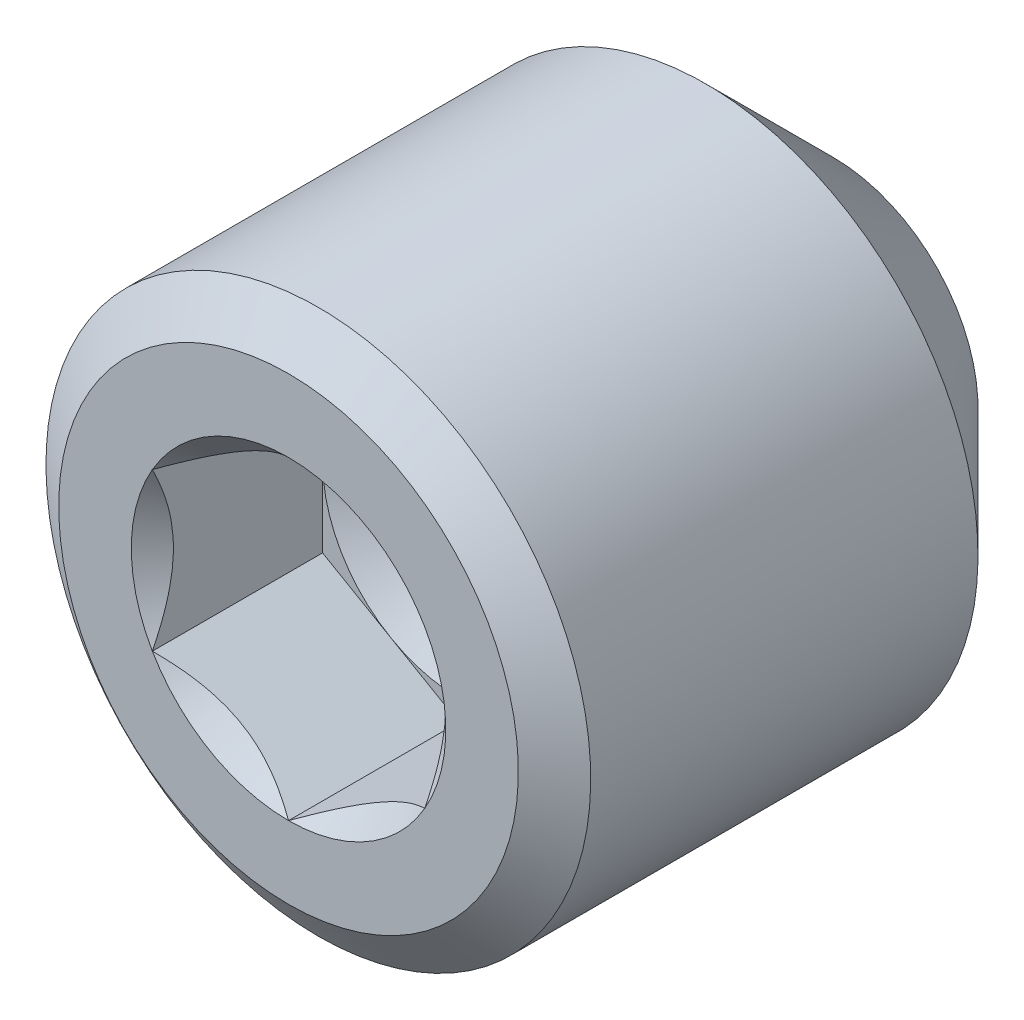
ISO-10303-21;
HEADER;
FILE_DESCRIPTION(('STEP AP214'),'2;1');
FILE_NAME('part.step','',(''),(''),'','','');
FILE_SCHEMA(('AUTOMOTIVE_DESIGN { 1 0 10303 214 1 1 1 1 }'));
ENDSEC;
DATA;
#1=APPLICATION_CONTEXT('core data for automotive mechanical design processes');
#2=APPLICATION_PROTOCOL_DEFINITION('international standard','automotive_design',2000,#1);
#3=PRODUCT_CONTEXT('',#1,'mechanical');
#4=PRODUCT('Part','Part','',(#3));
#5=PRODUCT_RELATED_PRODUCT_CATEGORY('part','',(#4));
#6=PRODUCT_DEFINITION_FORMATION('','',#4);
#7=PRODUCT_DEFINITION_CONTEXT('part definition',#1,'design');
#8=PRODUCT_DEFINITION('design','',#6,#7);
#9=PRODUCT_DEFINITION_SHAPE('','',#8);
#10=(LENGTH_UNIT() NAMED_UNIT(*) SI_UNIT(.MILLI.,.METRE.));
#11=(NAMED_UNIT(*) PLANE_ANGLE_UNIT() SI_UNIT($,.RADIAN.));
#12=(NAMED_UNIT(*) SI_UNIT($,.STERADIAN.) SOLID_ANGLE_UNIT());
#13=UNCERTAINTY_MEASURE_WITH_UNIT(LENGTH_MEASURE(1.E-05),#10,'distance_accuracy_value','');
#14=(GEOMETRIC_REPRESENTATION_CONTEXT(3) GLOBAL_UNCERTAINTY_ASSIGNED_CONTEXT((#13)) GLOBAL_UNIT_ASSIGNED_CONTEXT((#10,
#11,#12)) REPRESENTATION_CONTEXT('',''));
#15=CARTESIAN_POINT('',(0.,0.,0.));
#16=DIRECTION('',(0.,0.,1.));
#17=DIRECTION('',(1.,0.,0.));
#18=AXIS2_PLACEMENT_3D('',#15,#16,#17);
#19=CARTESIAN_POINT('',(-2.,3.46410161513775,1.5));
#20=DIRECTION('',(0.,0.,1.));
#21=DIRECTION('',(1.,0.,0.));
#22=AXIS2_PLACEMENT_3D('',#19,#20,#21);
#23=PLANE('',#22);
#24=CARTESIAN_POINT('',(0.,0.,1.5));
#25=DIRECTION('',(0.,0.,1.));
#26=DIRECTION('',(1.,0.,0.));
#27=AXIS2_PLACEMENT_3D('',#24,#25,#26);
#28=CIRCLE('',#27,2.);
#29=CARTESIAN_POINT('',(2.,0.,1.5));
#30=VERTEX_POINT('',#29);
#31=CARTESIAN_POINT('',(0.999999999999994,1.73205080756888,1.5));
#32=VERTEX_POINT('',#31);
#33=EDGE_CURVE('E126',#30,#32,#28,.T.);
#34=ORIENTED_EDGE('',*,*,#33,.F.);
#35=DIRECTION('',(0.,1.,0.));
#36=VECTOR('',#35,1.);
#37=CARTESIAN_POINT('',(2.,-1.15470053837925,1.5));
#38=LINE('',#37,#36);
#39=CARTESIAN_POINT('',(2.,1.15470053837925,1.5));
#40=VERTEX_POINT('',#39);
#41=EDGE_CURVE('E152',#30,#40,#38,.T.);
#42=ORIENTED_EDGE('',*,*,#41,.T.);
#43=DIRECTION('',(-0.866025403784439,0.5,0.));
#44=VECTOR('',#43,1.);
#45=CARTESIAN_POINT('',(2.,1.15470053837925,1.5));
#46=LINE('',#45,#44);
#47=EDGE_CURVE('E147',#40,#32,#46,.T.);
#48=ORIENTED_EDGE('',*,*,#47,.T.);
#49=EDGE_LOOP('',(#34,#42,#48));
#50=FACE_BOUND('',#49,.T.);
#51=ADVANCED_FACE('F39',(#50),#23,.T.);
#52=CARTESIAN_POINT('',(-0.999999999999995,1.73205080756888,1.5));
#53=VERTEX_POINT('',#52);
#54=EDGE_CURVE('E128',#32,#53,#28,.T.);
#55=ORIENTED_EDGE('',*,*,#54,.F.);
#56=CARTESIAN_POINT('',(0.,2.3094010767585,1.5));
#57=VERTEX_POINT('',#56);
#58=EDGE_CURVE('E139',#32,#57,#46,.T.);
#59=ORIENTED_EDGE('',*,*,#58,.T.);
#60=DIRECTION('',(-0.866025403784438,-0.5,0.));
#61=VECTOR('',#60,1.);
#62=CARTESIAN_POINT('',(0.,2.3094010767585,1.5));
#63=LINE('',#62,#61);
#64=EDGE_CURVE('E142',#57,#53,#63,.T.);
#65=ORIENTED_EDGE('',*,*,#64,.T.);
#66=EDGE_LOOP('',(#55,#59,#65));
#67=FACE_BOUND('',#66,.T.);
#68=ADVANCED_FACE('F138',(#67),#23,.T.);
#69=CARTESIAN_POINT('',(-2.,0.,1.5));
#70=VERTEX_POINT('',#69);
#71=EDGE_CURVE('E143',#53,#70,#28,.T.);
#72=ORIENTED_EDGE('',*,*,#71,.F.);
#73=CARTESIAN_POINT('',(-2.,1.15470053837925,1.5));
#74=VERTEX_POINT('',#73);
#75=EDGE_CURVE('E154',#53,#74,#63,.T.);
#76=ORIENTED_EDGE('',*,*,#75,.T.);
#77=DIRECTION('',(0.,-1.,0.));
#78=VECTOR('',#77,1.);
#79=CARTESIAN_POINT('',(-2.,1.15470053837925,1.5));
#80=LINE('',#79,#78);
#81=EDGE_CURVE('E165',#74,#70,#80,.T.);
#82=ORIENTED_EDGE('',*,*,#81,.T.);
#83=EDGE_LOOP('',(#72,#76,#82));
#84=FACE_BOUND('',#83,.T.);
#85=ADVANCED_FACE('F242',(#84),#23,.T.);
#86=CARTESIAN_POINT('',(-1.,-1.73205080756887,1.5));
#87=VERTEX_POINT('',#86);
#88=EDGE_CURVE('E266',#70,#87,#28,.T.);
#89=ORIENTED_EDGE('',*,*,#88,.F.);
#90=CARTESIAN_POINT('',(-2.,-1.15470053837925,1.5));
#91=VERTEX_POINT('',#90);
#92=EDGE_CURVE('E164',#70,#91,#80,.T.);
#93=ORIENTED_EDGE('',*,*,#92,.T.);
#94=DIRECTION('',(0.866025403784439,-0.5,0.));
#95=VECTOR('',#94,1.);
#96=CARTESIAN_POINT('',(-2.,-1.15470053837925,1.5));
#97=LINE('',#96,#95);
#98=EDGE_CURVE('E169',#91,#87,#97,.T.);
#99=ORIENTED_EDGE('',*,*,#98,.T.);
#100=EDGE_LOOP('',(#89,#93,#99));
#101=FACE_BOUND('',#100,.T.);
#102=ADVANCED_FACE('F256',(#101),#23,.T.);
#103=CARTESIAN_POINT('',(1.,-1.73205080756887,1.5));
#104=VERTEX_POINT('',#103);
#105=EDGE_CURVE('E60',#87,#104,#28,.T.);
#106=ORIENTED_EDGE('',*,*,#105,.F.);
#107=CARTESIAN_POINT('',(0.,-2.3094010767585,1.5));
#108=VERTEX_POINT('',#107);
#109=EDGE_CURVE('E168',#87,#108,#97,.T.);
#110=ORIENTED_EDGE('',*,*,#109,.T.);
#111=DIRECTION('',(0.866025403784438,0.5,0.));
#112=VECTOR('',#111,1.);
#113=CARTESIAN_POINT('',(0.,-2.3094010767585,1.5));
#114=LINE('',#113,#112);
#115=EDGE_CURVE('E173',#108,#104,#114,.T.);
#116=ORIENTED_EDGE('',*,*,#115,.T.);
#117=EDGE_LOOP('',(#106,#110,#116));
#118=FACE_BOUND('',#117,.T.);
#119=ADVANCED_FACE('F247',(#118),#23,.T.);
#120=CARTESIAN_POINT('',(0.,0.,4.));
#121=DIRECTION('',(0.,0.,-1.));
#122=DIRECTION('',(0.,1.,0.));
#123=AXIS2_PLACEMENT_3D('',#120,#121,#122);
#124=PLANE('',#123);
#125=CARTESIAN_POINT('',(0.,0.,4.));
#126=DIRECTION('',(0.,0.,1.));
#127=DIRECTION('',(1.,0.,0.));
#128=AXIS2_PLACEMENT_3D('',#125,#126,#127);
#129=CIRCLE('',#128,2.3094010767585);
#130=CARTESIAN_POINT('',(0.,2.3094010767585,4.));
#131=VERTEX_POINT('',#130);
#132=CARTESIAN_POINT('',(-2.,1.15470053837925,4.));
#133=VERTEX_POINT('',#132);
#134=EDGE_CURVE('E290',#131,#133,#129,.T.);
#135=ORIENTED_EDGE('',*,*,#134,.F.);
#136=CARTESIAN_POINT('',(2.,1.15470053837925,4.));
#137=VERTEX_POINT('',#136);
#138=EDGE_CURVE('E291',#137,#131,#129,.T.);
#139=ORIENTED_EDGE('',*,*,#138,.F.);
#140=CARTESIAN_POINT('',(2.,-1.15470053837925,4.));
#141=VERTEX_POINT('',#140);
#142=EDGE_CURVE('E67',#141,#137,#129,.T.);
#143=ORIENTED_EDGE('',*,*,#142,.F.);
#144=CARTESIAN_POINT('',(0.,-2.3094010767585,4.));
#145=VERTEX_POINT('',#144);
#146=EDGE_CURVE('E286',#145,#141,#129,.T.);
#147=ORIENTED_EDGE('',*,*,#146,.F.);
#148=CARTESIAN_POINT('',(-2.,-1.15470053837925,4.));
#149=VERTEX_POINT('',#148);
#150=EDGE_CURVE('E283',#149,#145,#129,.T.);
#151=ORIENTED_EDGE('',*,*,#150,.F.);
#152=EDGE_CURVE('E285',#133,#149,#129,.T.);
#153=ORIENTED_EDGE('',*,*,#152,.F.);
#154=EDGE_LOOP('',(#135,#139,#143,#147,#151,#153));
#155=FACE_BOUND('',#154,.T.);
#156=CARTESIAN_POINT('',(0.,0.,4.));
#157=DIRECTION('',(0.,0.,1.));
#158=DIRECTION('',(0.,-1.,0.));
#159=AXIS2_PLACEMENT_3D('',#156,#157,#158);
#160=CIRCLE('',#159,3.375);
#161=CARTESIAN_POINT('',(0.,-3.375,4.));
#162=VERTEX_POINT('',#161);
#163=EDGE_CURVE('E53',#162,#162,#160,.T.);
#164=ORIENTED_EDGE('',*,*,#163,.T.);
#165=EDGE_LOOP('',(#164));
#166=FACE_BOUND('',#165,.T.);
#167=ADVANCED_FACE('F41',(#155,#166),#124,.F.);
#168=CARTESIAN_POINT('',(0.,0.,3.56237028861893));
#169=DIRECTION('',(0.,0.,-1.));
#170=DIRECTION('',(0.,1.,0.));
#171=AXIS2_PLACEMENT_3D('',#168,#169,#170);
#172=CONICAL_SURFACE('',#171,4.,0.959931088596879);
#173=ORIENTED_EDGE('',*,*,#163,.F.);
#174=EDGE_LOOP('',(#173));
#175=FACE_BOUND('',#174,.T.);
#176=CARTESIAN_POINT('',(0.,0.,3.56237028861893));
#177=DIRECTION('',(0.,0.,1.));
#178=DIRECTION('',(0.,-1.,0.));
#179=AXIS2_PLACEMENT_3D('',#176,#177,#178);
#180=CIRCLE('',#179,4.);
#181=CARTESIAN_POINT('',(0.,-4.,3.56237028861893));
#182=VERTEX_POINT('',#181);
#183=EDGE_CURVE('E200',#182,#182,#180,.T.);
#184=ORIENTED_EDGE('',*,*,#183,.T.);
#185=EDGE_LOOP('',(#184));
#186=FACE_BOUND('',#185,.T.);
#187=ADVANCED_FACE('F206',(#175,#186),#172,.T.);
#188=CARTESIAN_POINT('',(0.,0.,-2.72317118456644));
#189=DIRECTION('',(0.,0.,1.));
#190=DIRECTION('',(0.,-1.,0.));
#191=AXIS2_PLACEMENT_3D('',#188,#189,#190);
#192=CYLINDRICAL_SURFACE('',#191,4.);
#193=ORIENTED_EDGE('',*,*,#183,.F.);
#194=EDGE_LOOP('',(#193));
#195=FACE_BOUND('',#194,.T.);
#196=CARTESIAN_POINT('',(0.,0.,-2.12500000000002));
#197=DIRECTION('',(0.,0.,1.));
#198=DIRECTION('',(0.,-1.,0.));
#199=AXIS2_PLACEMENT_3D('',#196,#197,#198);
#200=CIRCLE('',#199,4.);
#201=CARTESIAN_POINT('',(0.,-4.,-2.12500000000002));
#202=VERTEX_POINT('',#201);
#203=EDGE_CURVE('E197',#202,#202,#200,.T.);
#204=ORIENTED_EDGE('',*,*,#203,.T.);
#205=EDGE_LOOP('',(#204));
#206=FACE_BOUND('',#205,.T.);
#207=ADVANCED_FACE('F209',(#195,#206),#192,.T.);
#208=CARTESIAN_POINT('',(0.,0.,-4.));
#209=DIRECTION('',(0.,0.,1.));
#210=DIRECTION('',(0.,-1.,0.));
#211=AXIS2_PLACEMENT_3D('',#208,#209,#210);
#212=CONICAL_SURFACE('',#211,2.125,0.785398163397453);
#213=ORIENTED_EDGE('',*,*,#203,.F.);
#214=EDGE_LOOP('',(#213));
#215=FACE_BOUND('',#214,.T.);
#216=CARTESIAN_POINT('',(0.,0.,-4.));
#217=DIRECTION('',(0.,0.,1.));
#218=DIRECTION('',(0.,-1.,0.));
#219=AXIS2_PLACEMENT_3D('',#216,#217,#218);
#220=CIRCLE('',#219,2.125);
#221=CARTESIAN_POINT('',(0.,-2.125,-4.));
#222=VERTEX_POINT('',#221);
#223=EDGE_CURVE('E181',#222,#222,#220,.T.);
#224=ORIENTED_EDGE('',*,*,#223,.T.);
#225=EDGE_LOOP('',(#224));
#226=FACE_BOUND('',#225,.T.);
#227=ADVANCED_FACE('F214',(#215,#226),#212,.T.);
#228=CARTESIAN_POINT('',(0.,0.,-2.72317118456644));
#229=DIRECTION('',(0.,0.,-1.));
#230=DIRECTION('',(0.,1.,0.));
#231=AXIS2_PLACEMENT_3D('',#228,#229,#230);
#232=CONICAL_SURFACE('',#231,0.,1.02974425867666);
#233=ORIENTED_EDGE('',*,*,#223,.F.);
#234=EDGE_LOOP('',(#233));
#235=FACE_BOUND('',#234,.T.);
#236=CARTESIAN_POINT('',(0.,0.,-2.72317118456644));
#237=VERTEX_POINT('',#236);
#238=VERTEX_LOOP('',#237);
#239=FACE_BOUND('',#238,.T.);
#240=ADVANCED_FACE('F220',(#235,#239),#232,.F.);
#241=CARTESIAN_POINT('',(0.,0.,4.));
#242=DIRECTION('',(0.,0.,1.));
#243=DIRECTION('',(1.,0.,0.));
#244=AXIS2_PLACEMENT_3D('',#241,#242,#243);
#245=CONICAL_SURFACE('',#244,2.3094010767585,0.78539816339745);
#246=ORIENTED_EDGE('',*,*,#134,.T.);
#247=CARTESIAN_POINT('',(0.000199999999999686,2.30951654681234,4.00011547871366));
#248=CARTESIAN_POINT('',(-0.0685530340307059,2.26982196410711,3.96045309022559));
#249=CARTESIAN_POINT('',(-0.138455742135512,2.22946361676572,3.92311998228416));
#250=CARTESIAN_POINT('',(-0.280995244550437,2.1471683966763,3.85476368513614));
#251=CARTESIAN_POINT('',(-0.353645597565359,2.10522369580642,3.82377853373722));
#252=CARTESIAN_POINT('',(-0.500141601053972,2.02064418875706,3.77070021654414));
#253=CARTESIAN_POINT('',(-0.573949935246295,1.97803092714269,3.74847362717661));
#254=CARTESIAN_POINT('',(-0.723191631835264,1.89186619344273,3.71422881667508));
#255=CARTESIAN_POINT('',(-0.798620433918152,1.84831735425552,3.70218502914414));
#256=CARTESIAN_POINT('',(-0.92861550067108,1.7732646674724,3.69131851190557));
#257=CARTESIAN_POINT('',(-0.983013783970109,1.74185780396625,3.68970975360997));
#258=CARTESIAN_POINT('',(-1.09172145551969,1.67909540053412,3.69241887759871));
#259=CARTESIAN_POINT('',(-1.14603080592134,1.64773988246021,3.69673883775797));
#260=CARTESIAN_POINT('',(-1.25413672758934,1.5853248994842,3.71105956740991));
#261=CARTESIAN_POINT('',(-1.30793265655479,1.55426580541469,3.72106669276201));
#262=CARTESIAN_POINT('',(-1.41459426230557,1.49268469862228,3.74621243024966));
#263=CARTESIAN_POINT('',(-1.46746001007071,1.46216264491916,3.76135064904224));
#264=CARTESIAN_POINT('',(-1.60287973308984,1.38397803138048,3.80629450342919));
#265=CARTESIAN_POINT('',(-1.68459383484948,1.33680037273297,3.83948883942582));
#266=CARTESIAN_POINT('',(-1.8047470372578,1.26742988897853,3.89552582317137));
#267=CARTESIAN_POINT('',(-1.84434285210918,1.24456923461531,3.91521470294694));
#268=CARTESIAN_POINT('',(-1.92280095888787,1.19927142554652,3.95638731836487));
#269=CARTESIAN_POINT('',(-1.96166368359374,1.17683402097614,3.97786995165125));
#270=CARTESIAN_POINT('',(-2.0002,1.15458506832541,4.00011547871366));
#271=B_SPLINE_CURVE_WITH_KNOTS('',3,(#247,#248,#249,#250,#251,#252,#253,#254,#255,#256,#257,
#258,#259,#260,#261,#262,#263,#264,#265,#266,#267,#268,#269,#270),.UNSPECIFIED.,.F.,.F.,(4,2,2,
2,2,2,2,2,2,2,2,4),(0.,0.266420613771064,0.534393751523389,0.798110374376914,1.06116288956936,
1.24939906803722,1.43770123566247,1.62621426093932,1.81471283831913,2.11415604834145,
2.2634717071779,2.41269626969771),.UNSPECIFIED.);
#272=EDGE_CURVE('E11',#131,#133,#271,.T.);
#273=ORIENTED_EDGE('',*,*,#272,.F.);
#274=EDGE_LOOP('',(#246,#273));
#275=FACE_BOUND('',#274,.T.);
#276=ADVANCED_FACE('F226',(#275),#245,.F.);
#277=ORIENTED_EDGE('',*,*,#152,.T.);
#278=CARTESIAN_POINT('',(-2.,-2.30294417292923,4.74077135502772));
#279=CARTESIAN_POINT('',(-2.,-2.24687002663712,4.69844327362596));
#280=CARTESIAN_POINT('',(-2.,-2.19048190536959,4.65652515686434));
#281=CARTESIAN_POINT('',(-2.,-2.07695390496424,4.57369041786102));
#282=CARTESIAN_POINT('',(-2.,-2.01981384066454,4.53277404966807));
#283=CARTESIAN_POINT('',(-2.,-1.90424016804776,4.45183345201856));
#284=CARTESIAN_POINT('',(-2.,-1.8457999674391,4.41181859155987));
#285=CARTESIAN_POINT('',(-2.,-1.7279274546176,4.33328899366429));
#286=CARTESIAN_POINT('',(-2.,-1.66849521292324,4.29477415024314));
#287=CARTESIAN_POINT('',(-2.,-1.4816299571002,4.17764065160429));
#288=CARTESIAN_POINT('',(-2.,-1.35220318163536,4.10214590172964));
#289=CARTESIAN_POINT('',(-2.,-1.08689521592924,3.96404935099438));
#290=CARTESIAN_POINT('',(-2.,-0.951037763938192,3.9014040859035));
#291=CARTESIAN_POINT('',(-2.,-0.747111912259409,3.82476354387514));
#292=CARTESIAN_POINT('',(-2.,-0.682064034147876,3.80276717991912));
#293=CARTESIAN_POINT('',(-2.,-0.550398103294752,3.76399668766014));
#294=CARTESIAN_POINT('',(-2.,-0.483779942722476,3.74722291912118));
#295=CARTESIAN_POINT('',(-2.,-0.350484328847655,3.72004825788445));
#296=CARTESIAN_POINT('',(-2.,-0.283829489364786,3.70953817674169));
#297=CARTESIAN_POINT('',(-2.,-0.149806987139377,3.69509608554492));
#298=CARTESIAN_POINT('',(-2.,-0.0824394489341223,3.69116294473311));
#299=CARTESIAN_POINT('',(-2.,0.0499055622944891,3.69016647693372));
#300=CARTESIAN_POINT('',(-2.,0.114881285143171,3.69285964485041));
#301=CARTESIAN_POINT('',(-2.,0.24427592148276,3.70443007042269));
#302=CARTESIAN_POINT('',(-2.,0.308694780266753,3.71330792883322));
#303=CARTESIAN_POINT('',(-2.,0.437599788610704,3.73691365929615));
#304=CARTESIAN_POINT('',(-2.,0.502067428644594,3.75174108344651));
#305=CARTESIAN_POINT('',(-2.,0.629594322598305,3.78645788362797));
#306=CARTESIAN_POINT('',(-2.,0.69265369388315,3.80634683610628));
#307=CARTESIAN_POINT('',(-2.,0.891187889210544,3.8764469792562));
#308=CARTESIAN_POINT('',(-2.,1.02383545707306,3.93464180032151));
#309=CARTESIAN_POINT('',(-2.,1.28290932150074,4.06403057545958));
#310=CARTESIAN_POINT('',(-2.,1.4093111258757,4.13527123141484));
#311=CARTESIAN_POINT('',(-2.,1.59200441438963,4.24644199187472));
#312=CARTESIAN_POINT('',(-2.,1.65027549026191,4.28318219033738));
#313=CARTESIAN_POINT('',(-2.,1.76581760389243,4.35821451418377));
#314=CARTESIAN_POINT('',(-2.,1.82308856543105,4.39650675711804));
#315=CARTESIAN_POINT('',(-2.,1.93629654762084,4.47404226408123));
#316=CARTESIAN_POINT('',(-2.,1.99224062500539,4.51327527613359));
#317=CARTESIAN_POINT('',(-2.,2.103364240299,4.59277883073652));
#318=CARTESIAN_POINT('',(-2.,2.15854398422468,4.6330490850006));
#319=CARTESIAN_POINT('',(-2.,2.21340370692658,4.67374423814594));
#320=B_SPLINE_CURVE_WITH_KNOTS('',3,(#278,#279,#280,#281,#282,#283,#284,#285,#286,#287,#288,
#289,#290,#291,#292,#293,#294,#295,#296,#297,#298,#299,#300,#301,#302,#303,#304,#305,#306,#307,
#308,#309,#310,#311,#312,#313,#314,#315,#316,#317,#318,#319),.UNSPECIFIED.,.F.,.F.,(4,2,2,2,2,2,
2,2,2,2,2,2,2,2,2,2,2,2,2,2,4),(0.,0.210772731976891,0.421598374658589,0.634057554623487,
0.846501695870169,1.29562155455624,1.74319622821645,1.94902062110207,2.15485918928325,
2.35699582502635,2.5590977043214,2.75388435553556,2.94868993014815,3.14690093452585,
3.34509535789702,3.77838155837653,4.21325029921625,4.41989056685647,4.62654651460921,
4.83152377111289,5.03644465914085),.UNSPECIFIED.);
#321=EDGE_CURVE('E277',#133,#149,#320,.F.);
#322=ORIENTED_EDGE('',*,*,#321,.F.);
#323=EDGE_LOOP('',(#277,#322));
#324=FACE_BOUND('',#323,.T.);
#325=ADVANCED_FACE('F232',(#324),#245,.F.);
#326=ORIENTED_EDGE('',*,*,#150,.T.);
#327=CARTESIAN_POINT('',(-2.0002,-1.15458506832541,4.00011547871366));
#328=CARTESIAN_POINT('',(-1.93144696596929,-1.19427965103065,3.96045309022559));
#329=CARTESIAN_POINT('',(-1.86154425786449,-1.23463799837204,3.92311998228416));
#330=CARTESIAN_POINT('',(-1.71900475544956,-1.31693321846145,3.85476368513614));
#331=CARTESIAN_POINT('',(-1.64635440243464,-1.35887791933134,3.82377853373722));
#332=CARTESIAN_POINT('',(-1.49985839894603,-1.44345742638069,3.77070021654414));
#333=CARTESIAN_POINT('',(-1.4260500647537,-1.48607068799507,3.74847362717661));
#334=CARTESIAN_POINT('',(-1.27680836816473,-1.57223542169503,3.71422881667508));
#335=CARTESIAN_POINT('',(-1.20137956608185,-1.61578426088223,3.70218502914413));
#336=CARTESIAN_POINT('',(-1.07138449932892,-1.69083694766536,3.69131851190557));
#337=CARTESIAN_POINT('',(-1.01698621602989,-1.72224381117151,3.68970975360997));
#338=CARTESIAN_POINT('',(-0.908278544480304,-1.78500621460364,3.69241887759871));
#339=CARTESIAN_POINT('',(-0.853969194078659,-1.81636173267754,3.69673883775797));
#340=CARTESIAN_POINT('',(-0.745863272410659,-1.87877671565355,3.7110595674099));
#341=CARTESIAN_POINT('',(-0.692067343445205,-1.90983580972306,3.721066692762));
#342=CARTESIAN_POINT('',(-0.585405737694424,-1.97141691651548,3.74621243024966));
#343=CARTESIAN_POINT('',(-0.532539989929285,-2.00193897021859,3.76135064904224));
#344=CARTESIAN_POINT('',(-0.397120266910154,-2.08012358375727,3.80629450342919));
#345=CARTESIAN_POINT('',(-0.31540616515052,-2.12730124240478,3.83948883942582));
#346=CARTESIAN_POINT('',(-0.195252962742196,-2.19667172615922,3.89552582317137));
#347=CARTESIAN_POINT('',(-0.155657147890821,-2.21953238052245,3.91521470294694));
#348=CARTESIAN_POINT('',(-0.0771990411121266,-2.26483018959124,3.95638731836487));
#349=CARTESIAN_POINT('',(-0.0383363164062588,-2.28726759416161,3.97786995165125));
#350=CARTESIAN_POINT('',(0.000200000000000579,-2.30951654681234,4.00011547871366));
#351=B_SPLINE_CURVE_WITH_KNOTS('',3,(#327,#328,#329,#330,#331,#332,#333,#334,#335,#336,#337,
#338,#339,#340,#341,#342,#343,#344,#345,#346,#347,#348,#349,#350),.UNSPECIFIED.,.F.,.F.,(4,2,2,
2,2,2,2,2,2,2,2,4),(0.,0.266420613771064,0.53439375152339,0.798110374376916,1.06116288956937,
1.24939906803722,1.43770123566248,1.62621426093932,1.81471283831914,2.11415604834145,
2.26347170717791,2.41269626969771),.UNSPECIFIED.);
#352=EDGE_CURVE('E280',#149,#145,#351,.T.);
#353=ORIENTED_EDGE('',*,*,#352,.F.);
#354=EDGE_LOOP('',(#326,#353));
#355=FACE_BOUND('',#354,.T.);
#356=ADVANCED_FACE('F376',(#355),#245,.F.);
#357=ORIENTED_EDGE('',*,*,#146,.T.);
#358=CARTESIAN_POINT('',(-0.000199999999999565,-2.30951654681234,4.00011547871366));
#359=CARTESIAN_POINT('',(0.0685530340307061,-2.26982196410711,3.96045309022559));
#360=CARTESIAN_POINT('',(0.138455742135512,-2.22946361676572,3.92311998228416));
#361=CARTESIAN_POINT('',(0.280995244550437,-2.1471683966763,3.85476368513614));
#362=CARTESIAN_POINT('',(0.353645597565359,-2.10522369580642,3.82377853373722));
#363=CARTESIAN_POINT('',(0.500141601053972,-2.02064418875706,3.77070021654414));
#364=CARTESIAN_POINT('',(0.573949935246295,-1.97803092714269,3.74847362717661));
#365=CARTESIAN_POINT('',(0.723191631835265,-1.89186619344273,3.71422881667508));
#366=CARTESIAN_POINT('',(0.798620433918153,-1.84831735425552,3.70218502914413));
#367=CARTESIAN_POINT('',(0.92861550067108,-1.7732646674724,3.69131851190557));
#368=CARTESIAN_POINT('',(0.98301378397011,-1.74185780396625,3.68970975360997));
#369=CARTESIAN_POINT('',(1.09172145551969,-1.67909540053412,3.69241887759871));
#370=CARTESIAN_POINT('',(1.14603080592134,-1.64773988246021,3.69673883775797));
#371=CARTESIAN_POINT('',(1.25413672758934,-1.5853248994842,3.7110595674099));
#372=CARTESIAN_POINT('',(1.30793265655479,-1.55426580541469,3.72106669276201));
#373=CARTESIAN_POINT('',(1.41459426230557,-1.49268469862228,3.74621243024966));
#374=CARTESIAN_POINT('',(1.46746001007071,-1.46216264491917,3.76135064904224));
#375=CARTESIAN_POINT('',(1.60287973308985,-1.38397803138049,3.80629450342919));
#376=CARTESIAN_POINT('',(1.68459383484948,-1.33680037273297,3.83948883942582));
#377=CARTESIAN_POINT('',(1.8047470372578,-1.26742988897853,3.89552582317137));
#378=CARTESIAN_POINT('',(1.84434285210918,-1.24456923461531,3.91521470294694));
#379=CARTESIAN_POINT('',(1.92280095888787,-1.19927142554652,3.95638731836487));
#380=CARTESIAN_POINT('',(1.96166368359374,-1.17683402097614,3.97786995165125));
#381=CARTESIAN_POINT('',(2.0002,-1.15458506832541,4.00011547871366));
#382=B_SPLINE_CURVE_WITH_KNOTS('',3,(#358,#359,#360,#361,#362,#363,#364,#365,#366,#367,#368,
#369,#370,#371,#372,#373,#374,#375,#376,#377,#378,#379,#380,#381),.UNSPECIFIED.,.F.,.F.,(4,2,2,
2,2,2,2,2,2,2,2,4),(0.,0.266420613771064,0.534393751523389,0.798110374376914,1.06116288956936,
1.24939906803722,1.43770123566247,1.62621426093932,1.81471283831913,2.11415604834145,
2.2634717071779,2.41269626969771),.UNSPECIFIED.);
#383=EDGE_CURVE('E332',#145,#141,#382,.T.);
#384=ORIENTED_EDGE('',*,*,#383,.F.);
#385=EDGE_LOOP('',(#357,#384));
#386=FACE_BOUND('',#385,.T.);
#387=ADVANCED_FACE('F370',(#386),#245,.F.);
#388=ORIENTED_EDGE('',*,*,#142,.T.);
#389=CARTESIAN_POINT('',(2.,-2.30294417292923,4.74077135502772));
#390=CARTESIAN_POINT('',(2.,-2.24687002663712,4.69844327362596));
#391=CARTESIAN_POINT('',(2.,-2.19048190536959,4.65652515686434));
#392=CARTESIAN_POINT('',(2.,-2.07695390496424,4.57369041786102));
#393=CARTESIAN_POINT('',(2.,-2.01981384066454,4.53277404966807));
#394=CARTESIAN_POINT('',(2.,-1.90424016804776,4.45183345201856));
#395=CARTESIAN_POINT('',(2.,-1.8457999674391,4.41181859155987));
#396=CARTESIAN_POINT('',(2.,-1.7279274546176,4.33328899366429));
#397=CARTESIAN_POINT('',(2.,-1.66849521292324,4.29477415024314));
#398=CARTESIAN_POINT('',(2.,-1.4816299571002,4.17764065160429));
#399=CARTESIAN_POINT('',(2.,-1.35220318163536,4.10214590172964));
#400=CARTESIAN_POINT('',(2.,-1.08689521592924,3.96404935099438));
#401=CARTESIAN_POINT('',(2.,-0.951037763938191,3.90140408590349));
#402=CARTESIAN_POINT('',(2.,-0.747111912259408,3.82476354387514));
#403=CARTESIAN_POINT('',(2.,-0.682064034147875,3.80276717991912));
#404=CARTESIAN_POINT('',(2.,-0.550398103294752,3.76399668766014));
#405=CARTESIAN_POINT('',(2.,-0.483779942722475,3.74722291912118));
#406=CARTESIAN_POINT('',(2.,-0.350484328847654,3.72004825788445));
#407=CARTESIAN_POINT('',(2.,-0.283829489364785,3.70953817674169));
#408=CARTESIAN_POINT('',(2.,-0.149806987139377,3.69509608554492));
#409=CARTESIAN_POINT('',(2.,-0.0824394489341218,3.69116294473311));
#410=CARTESIAN_POINT('',(2.,0.0499055622944896,3.69016647693372));
#411=CARTESIAN_POINT('',(2.,0.114881285143172,3.69285964485041));
#412=CARTESIAN_POINT('',(2.,0.24427592148276,3.70443007042269));
#413=CARTESIAN_POINT('',(2.,0.308694780266753,3.71330792883322));
#414=CARTESIAN_POINT('',(2.,0.437599788610704,3.73691365929615));
#415=CARTESIAN_POINT('',(2.,0.502067428644594,3.75174108344651));
#416=CARTESIAN_POINT('',(2.,0.629594322598305,3.78645788362797));
#417=CARTESIAN_POINT('',(2.,0.69265369388315,3.80634683610628));
#418=CARTESIAN_POINT('',(2.,0.891187889210544,3.8764469792562));
#419=CARTESIAN_POINT('',(2.,1.02383545707306,3.93464180032151));
#420=CARTESIAN_POINT('',(2.,1.28290932150074,4.06403057545958));
#421=CARTESIAN_POINT('',(2.,1.4093111258757,4.13527123141484));
#422=CARTESIAN_POINT('',(2.,1.59200441438963,4.24644199187472));
#423=CARTESIAN_POINT('',(2.,1.65027549026191,4.28318219033738));
#424=CARTESIAN_POINT('',(2.,1.76581760389243,4.35821451418377));
#425=CARTESIAN_POINT('',(2.,1.82308856543105,4.39650675711804));
#426=CARTESIAN_POINT('',(2.,1.93629654762084,4.47404226408123));
#427=CARTESIAN_POINT('',(2.,1.99224062500539,4.51327527613359));
#428=CARTESIAN_POINT('',(2.,2.103364240299,4.59277883073652));
#429=CARTESIAN_POINT('',(2.,2.15854398422468,4.6330490850006));
#430=CARTESIAN_POINT('',(2.,2.21340370692659,4.67374423814594));
#431=B_SPLINE_CURVE_WITH_KNOTS('',3,(#389,#390,#391,#392,#393,#394,#395,#396,#397,#398,#399,
#400,#401,#402,#403,#404,#405,#406,#407,#408,#409,#410,#411,#412,#413,#414,#415,#416,#417,#418,
#419,#420,#421,#422,#423,#424,#425,#426,#427,#428,#429,#430),.UNSPECIFIED.,.F.,.F.,(4,2,2,2,2,2,
2,2,2,2,2,2,2,2,2,2,2,2,2,2,4),(0.,0.210772731976891,0.421598374658589,0.634057554623487,
0.846501695870169,1.29562155455624,1.74319622821645,1.94902062110207,2.15485918928325,
2.35699582502635,2.5590977043214,2.75388435553556,2.94868993014815,3.14690093452585,
3.34509535789702,3.77838155837653,4.21325029921625,4.41989056685646,4.62654651460921,
4.83152377111289,5.03644465914085),.UNSPECIFIED.);
#432=EDGE_CURVE('E326',#141,#137,#431,.T.);
#433=ORIENTED_EDGE('',*,*,#432,.F.);
#434=EDGE_LOOP('',(#388,#433));
#435=FACE_BOUND('',#434,.T.);
#436=ADVANCED_FACE('F254',(#435),#245,.F.);
#437=ORIENTED_EDGE('',*,*,#138,.T.);
#438=CARTESIAN_POINT('',(2.0002,1.15458506832541,4.00011547871366));
#439=CARTESIAN_POINT('',(1.93144696596929,1.19427965103065,3.96045309022559));
#440=CARTESIAN_POINT('',(1.86154425786449,1.23463799837204,3.92311998228416));
#441=CARTESIAN_POINT('',(1.71900475544956,1.31693321846145,3.85476368513614));
#442=CARTESIAN_POINT('',(1.64635440243464,1.35887791933134,3.82377853373722));
#443=CARTESIAN_POINT('',(1.49985839894603,1.44345742638069,3.77070021654414));
#444=CARTESIAN_POINT('',(1.42605006475371,1.48607068799507,3.74847362717661));
#445=CARTESIAN_POINT('',(1.27680836816474,1.57223542169503,3.71422881667508));
#446=CARTESIAN_POINT('',(1.20137956608185,1.61578426088223,3.70218502914414));
#447=CARTESIAN_POINT('',(1.07138449932892,1.69083694766536,3.69131851190557));
#448=CARTESIAN_POINT('',(1.01698621602989,1.72224381117151,3.68970975360997));
#449=CARTESIAN_POINT('',(0.908278544480306,1.78500621460364,3.69241887759871));
#450=CARTESIAN_POINT('',(0.85396919407866,1.81636173267754,3.69673883775798));
#451=CARTESIAN_POINT('',(0.745863272410661,1.87877671565355,3.71105956740991));
#452=CARTESIAN_POINT('',(0.692067343445207,1.90983580972306,3.72106669276201));
#453=CARTESIAN_POINT('',(0.585405737694425,1.97141691651547,3.74621243024966));
#454=CARTESIAN_POINT('',(0.532539989929286,2.00193897021859,3.76135064904224));
#455=CARTESIAN_POINT('',(0.397120266910155,2.08012358375727,3.80629450342919));
#456=CARTESIAN_POINT('',(0.315406165150521,2.12730124240478,3.83948883942582));
#457=CARTESIAN_POINT('',(0.195252962742197,2.19667172615922,3.89552582317137));
#458=CARTESIAN_POINT('',(0.155657147890822,2.21953238052245,3.91521470294694));
#459=CARTESIAN_POINT('',(0.0771990411121269,2.26483018959123,3.95638731836487));
#460=CARTESIAN_POINT('',(0.038336316406259,2.28726759416161,3.97786995165125));
#461=CARTESIAN_POINT('',(-0.000200000000000552,2.30951654681234,4.00011547871366));
#462=B_SPLINE_CURVE_WITH_KNOTS('',3,(#438,#439,#440,#441,#442,#443,#444,#445,#446,#447,#448,
#449,#450,#451,#452,#453,#454,#455,#456,#457,#458,#459,#460,#461),.UNSPECIFIED.,.F.,.F.,(4,2,2,
2,2,2,2,2,2,2,2,4),(0.,0.266420613771063,0.534393751523388,0.798110374376914,1.06116288956936,
1.24939906803722,1.43770123566247,1.62621426093932,1.81471283831913,2.11415604834145,
2.26347170717791,2.41269626969771),.UNSPECIFIED.);
#463=EDGE_CURVE('E150',#137,#131,#462,.T.);
#464=ORIENTED_EDGE('',*,*,#463,.F.);
#465=EDGE_LOOP('',(#437,#464));
#466=FACE_BOUND('',#465,.T.);
#467=ADVANCED_FACE('F234',(#466),#245,.F.);
#468=EDGE_CURVE('E130',#104,#30,#28,.T.);
#469=ORIENTED_EDGE('',*,*,#468,.F.);
#470=CARTESIAN_POINT('',(2.,-1.15470053837925,1.5));
#471=VERTEX_POINT('',#470);
#472=EDGE_CURVE('E172',#104,#471,#114,.T.);
#473=ORIENTED_EDGE('',*,*,#472,.T.);
#474=EDGE_CURVE('E176',#471,#30,#38,.T.);
#475=ORIENTED_EDGE('',*,*,#474,.T.);
#476=EDGE_LOOP('',(#469,#473,#475));
#477=FACE_BOUND('',#476,.T.);
#478=ADVANCED_FACE('F237',(#477),#23,.T.);
#479=CARTESIAN_POINT('',(0.,2.3094010767585,1.5));
#480=DIRECTION('',(-0.5,0.866025403784439,0.));
#481=DIRECTION('',(-0.866025403784439,-0.5,0.));
#482=AXIS2_PLACEMENT_3D('',#479,#480,#481);
#483=PLANE('',#482);
#484=DIRECTION('',(0.,0.,1.));
#485=VECTOR('',#484,1.);
#486=CARTESIAN_POINT('',(0.,2.3094010767585,1.5));
#487=LINE('',#486,#485);
#488=EDGE_CURVE('E149',#57,#131,#487,.T.);
#489=ORIENTED_EDGE('',*,*,#488,.T.);
#490=ORIENTED_EDGE('',*,*,#272,.T.);
#491=DIRECTION('',(0.,0.,1.));
#492=VECTOR('',#491,1.);
#493=CARTESIAN_POINT('',(-2.,1.15470053837925,1.5));
#494=LINE('',#493,#492);
#495=EDGE_CURVE('E191',#74,#133,#494,.T.);
#496=ORIENTED_EDGE('',*,*,#495,.F.);
#497=ORIENTED_EDGE('',*,*,#75,.F.);
#498=ORIENTED_EDGE('',*,*,#64,.F.);
#499=EDGE_LOOP('',(#489,#490,#496,#497,#498));
#500=FACE_BOUND('',#499,.T.);
#501=ADVANCED_FACE('F245',(#500),#483,.F.);
#502=CARTESIAN_POINT('',(-2.,1.15470053837925,1.5));
#503=DIRECTION('',(-1.,0.,0.));
#504=DIRECTION('',(0.,0.,1.));
#505=AXIS2_PLACEMENT_3D('',#502,#503,#504);
#506=PLANE('',#505);
#507=ORIENTED_EDGE('',*,*,#495,.T.);
#508=ORIENTED_EDGE('',*,*,#321,.T.);
#509=DIRECTION('',(0.,0.,1.));
#510=VECTOR('',#509,1.);
#511=CARTESIAN_POINT('',(-2.,-1.15470053837925,1.5));
#512=LINE('',#511,#510);
#513=EDGE_CURVE('E188',#91,#149,#512,.T.);
#514=ORIENTED_EDGE('',*,*,#513,.F.);
#515=ORIENTED_EDGE('',*,*,#92,.F.);
#516=ORIENTED_EDGE('',*,*,#81,.F.);
#517=EDGE_LOOP('',(#507,#508,#514,#515,#516));
#518=FACE_BOUND('',#517,.T.);
#519=ADVANCED_FACE('F252',(#518),#506,.F.);
#520=CARTESIAN_POINT('',(-2.,-1.15470053837925,1.5));
#521=DIRECTION('',(-0.5,-0.866025403784439,0.));
#522=DIRECTION('',(0.866025403784439,-0.5,0.));
#523=AXIS2_PLACEMENT_3D('',#520,#521,#522);
#524=PLANE('',#523);
#525=ORIENTED_EDGE('',*,*,#513,.T.);
#526=ORIENTED_EDGE('',*,*,#352,.T.);
#527=DIRECTION('',(0.,0.,1.));
#528=VECTOR('',#527,1.);
#529=CARTESIAN_POINT('',(0.,-2.3094010767585,1.5));
#530=LINE('',#529,#528);
#531=EDGE_CURVE('E185',#108,#145,#530,.T.);
#532=ORIENTED_EDGE('',*,*,#531,.F.);
#533=ORIENTED_EDGE('',*,*,#109,.F.);
#534=ORIENTED_EDGE('',*,*,#98,.F.);
#535=EDGE_LOOP('',(#525,#526,#532,#533,#534));
#536=FACE_BOUND('',#535,.T.);
#537=ADVANCED_FACE('F269',(#536),#524,.F.);
#538=CARTESIAN_POINT('',(0.,-2.3094010767585,1.5));
#539=DIRECTION('',(0.5,-0.866025403784439,0.));
#540=DIRECTION('',(0.866025403784439,0.5,0.));
#541=AXIS2_PLACEMENT_3D('',#538,#539,#540);
#542=PLANE('',#541);
#543=ORIENTED_EDGE('',*,*,#531,.T.);
#544=ORIENTED_EDGE('',*,*,#383,.T.);
#545=DIRECTION('',(0.,0.,1.));
#546=VECTOR('',#545,1.);
#547=CARTESIAN_POINT('',(2.,-1.15470053837925,1.5));
#548=LINE('',#547,#546);
#549=EDGE_CURVE('E182',#471,#141,#548,.T.);
#550=ORIENTED_EDGE('',*,*,#549,.F.);
#551=ORIENTED_EDGE('',*,*,#472,.F.);
#552=ORIENTED_EDGE('',*,*,#115,.F.);
#553=EDGE_LOOP('',(#543,#544,#550,#551,#552));
#554=FACE_BOUND('',#553,.T.);
#555=ADVANCED_FACE('F318',(#554),#542,.F.);
#556=CARTESIAN_POINT('',(2.,-1.15470053837925,1.5));
#557=DIRECTION('',(1.,0.,0.));
#558=DIRECTION('',(0.,0.,-1.));
#559=AXIS2_PLACEMENT_3D('',#556,#557,#558);
#560=PLANE('',#559);
#561=ORIENTED_EDGE('',*,*,#549,.T.);
#562=ORIENTED_EDGE('',*,*,#432,.T.);
#563=DIRECTION('',(0.,0.,1.));
#564=VECTOR('',#563,1.);
#565=CARTESIAN_POINT('',(2.,1.15470053837925,1.5));
#566=LINE('',#565,#564);
#567=EDGE_CURVE('E179',#40,#137,#566,.T.);
#568=ORIENTED_EDGE('',*,*,#567,.F.);
#569=ORIENTED_EDGE('',*,*,#41,.F.);
#570=ORIENTED_EDGE('',*,*,#474,.F.);
#571=EDGE_LOOP('',(#561,#562,#568,#569,#570));
#572=FACE_BOUND('',#571,.T.);
#573=ADVANCED_FACE('F314',(#572),#560,.F.);
#574=CARTESIAN_POINT('',(2.,1.15470053837925,1.5));
#575=DIRECTION('',(0.5,0.866025403784439,0.));
#576=DIRECTION('',(-0.866025403784439,0.5,0.));
#577=AXIS2_PLACEMENT_3D('',#574,#575,#576);
#578=PLANE('',#577);
#579=ORIENTED_EDGE('',*,*,#567,.T.);
#580=ORIENTED_EDGE('',*,*,#463,.T.);
#581=ORIENTED_EDGE('',*,*,#488,.F.);
#582=ORIENTED_EDGE('',*,*,#58,.F.);
#583=ORIENTED_EDGE('',*,*,#47,.F.);
#584=EDGE_LOOP('',(#579,#580,#581,#582,#583));
#585=FACE_BOUND('',#584,.T.);
#586=ADVANCED_FACE('F123',(#585),#578,.F.);
#587=CARTESIAN_POINT('',(0.,0.,1.5));
#588=DIRECTION('',(0.,0.,1.));
#589=DIRECTION('',(1.,0.,0.));
#590=AXIS2_PLACEMENT_3D('',#587,#588,#589);
#591=CONICAL_SURFACE('',#590,2.,1.0471975511966);
#592=CARTESIAN_POINT('',(0.,0.,0.345299461620755));
#593=VERTEX_POINT('',#592);
#594=VERTEX_LOOP('',#593);
#595=FACE_BOUND('',#594,.T.);
#596=ORIENTED_EDGE('',*,*,#33,.T.);
#597=ORIENTED_EDGE('',*,*,#54,.T.);
#598=ORIENTED_EDGE('',*,*,#71,.T.);
#599=ORIENTED_EDGE('',*,*,#88,.T.);
#600=ORIENTED_EDGE('',*,*,#105,.T.);
#601=ORIENTED_EDGE('',*,*,#468,.T.);
#602=EDGE_LOOP('',(#596,#597,#598,#599,#600,#601));
#603=FACE_BOUND('',#602,.T.);
#604=ADVANCED_FACE('F121',(#595,#603),#591,.F.);
#605=CLOSED_SHELL('',(#51,#68,#85,#102,#119,#167,#187,#207,#227,#240,#276,#325,#356,#387,#436,
#467,#478,#501,#519,#537,#555,#573,#586,#604));
#606=MANIFOLD_SOLID_BREP('B2',#605);
#607=ADVANCED_BREP_SHAPE_REPRESENTATION('',(#18,#606),#14);
#608=SHAPE_DEFINITION_REPRESENTATION(#9,#607);
ENDSEC;
END-ISO-10303-21;
